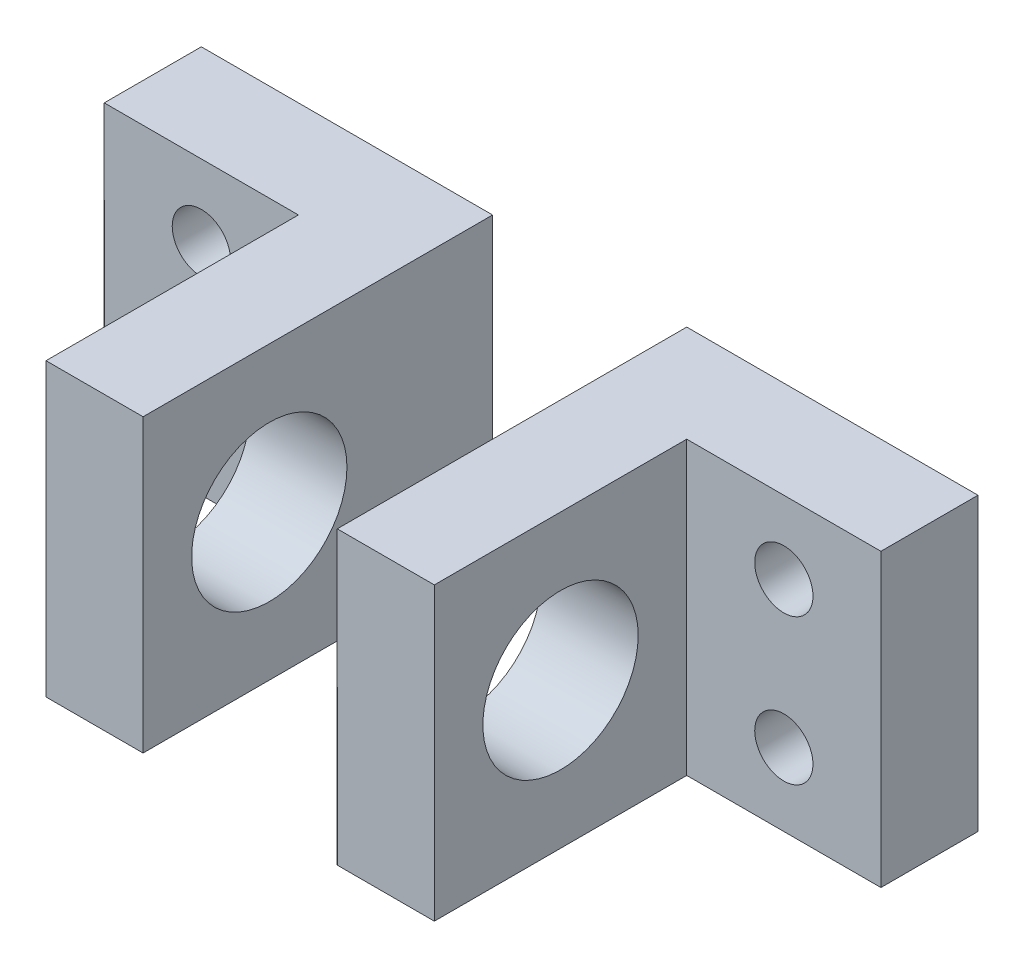
ISO-10303-21;
HEADER;
FILE_DESCRIPTION(('STEP AP214'),'2;1');
FILE_NAME('part.step','',(''),(''),'','','');
FILE_SCHEMA(('AUTOMOTIVE_DESIGN { 1 0 10303 214 1 1 1 1 }'));
ENDSEC;
DATA;
#1=APPLICATION_CONTEXT('core data for automotive mechanical design processes');
#2=APPLICATION_PROTOCOL_DEFINITION('international standard','automotive_design',2000,#1);
#3=PRODUCT_CONTEXT('',#1,'mechanical');
#4=PRODUCT('Part','Part','',(#3));
#5=PRODUCT_RELATED_PRODUCT_CATEGORY('part','',(#4));
#6=PRODUCT_DEFINITION_FORMATION('','',#4);
#7=PRODUCT_DEFINITION_CONTEXT('part definition',#1,'design');
#8=PRODUCT_DEFINITION('design','',#6,#7);
#9=PRODUCT_DEFINITION_SHAPE('','',#8);
#10=(LENGTH_UNIT() NAMED_UNIT(*) SI_UNIT(.MILLI.,.METRE.));
#11=(NAMED_UNIT(*) PLANE_ANGLE_UNIT() SI_UNIT($,.RADIAN.));
#12=(NAMED_UNIT(*) SI_UNIT($,.STERADIAN.) SOLID_ANGLE_UNIT());
#13=UNCERTAINTY_MEASURE_WITH_UNIT(LENGTH_MEASURE(1.E-05),#10,'distance_accuracy_value','');
#14=(GEOMETRIC_REPRESENTATION_CONTEXT(3) GLOBAL_UNCERTAINTY_ASSIGNED_CONTEXT((#13)) GLOBAL_UNIT_ASSIGNED_CONTEXT((#10,
#11,#12)) REPRESENTATION_CONTEXT('',''));
#15=CARTESIAN_POINT('',(0.,0.,0.));
#16=DIRECTION('',(0.,0.,1.));
#17=DIRECTION('',(1.,0.,0.));
#18=AXIS2_PLACEMENT_3D('',#15,#16,#17);
#19=CARTESIAN_POINT('',(20.,15.,-13.));
#20=DIRECTION('',(-1.,0.,0.));
#21=DIRECTION('',(0.,0.,1.));
#22=AXIS2_PLACEMENT_3D('',#19,#20,#21);
#23=PLANE('',#22);
#24=DIRECTION('',(0.,0.,-1.));
#25=VECTOR('',#24,1.);
#26=CARTESIAN_POINT('',(20.,0.,-13.));
#27=LINE('',#26,#25);
#28=CARTESIAN_POINT('',(20.,0.,-13.));
#29=VERTEX_POINT('',#28);
#30=CARTESIAN_POINT('',(20.,0.,-18.));
#31=VERTEX_POINT('',#30);
#32=EDGE_CURVE('E132',#29,#31,#27,.T.);
#33=ORIENTED_EDGE('',*,*,#32,.T.);
#34=DIRECTION('',(0.,-1.,0.));
#35=VECTOR('',#34,1.);
#36=CARTESIAN_POINT('',(20.,15.,-18.));
#37=LINE('',#36,#35);
#38=CARTESIAN_POINT('',(20.,15.,-18.));
#39=VERTEX_POINT('',#38);
#40=EDGE_CURVE('E12',#39,#31,#37,.T.);
#41=ORIENTED_EDGE('',*,*,#40,.F.);
#42=DIRECTION('',(0.,0.,-1.));
#43=VECTOR('',#42,1.);
#44=CARTESIAN_POINT('',(20.,15.,-13.));
#45=LINE('',#44,#43);
#46=CARTESIAN_POINT('',(20.,15.,-13.));
#47=VERTEX_POINT('',#46);
#48=EDGE_CURVE('E143',#47,#39,#45,.T.);
#49=ORIENTED_EDGE('',*,*,#48,.F.);
#50=DIRECTION('',(0.,-1.,0.));
#51=VECTOR('',#50,1.);
#52=CARTESIAN_POINT('',(20.,15.,-13.));
#53=LINE('',#52,#51);
#54=EDGE_CURVE('E128',#47,#29,#53,.T.);
#55=ORIENTED_EDGE('',*,*,#54,.T.);
#56=EDGE_LOOP('',(#33,#41,#49,#55));
#57=FACE_BOUND('',#56,.T.);
#58=ADVANCED_FACE('F48',(#57),#23,.F.);
#59=CARTESIAN_POINT('',(20.,15.,-18.));
#60=DIRECTION('',(0.,0.,1.));
#61=DIRECTION('',(1.,0.,0.));
#62=AXIS2_PLACEMENT_3D('',#59,#60,#61);
#63=PLANE('',#62);
#64=CARTESIAN_POINT('',(15.,11.25,-18.));
#65=DIRECTION('',(0.,0.,1.));
#66=DIRECTION('',(1.,0.,0.));
#67=AXIS2_PLACEMENT_3D('',#64,#65,#66);
#68=CIRCLE('',#67,1.5);
#69=CARTESIAN_POINT('',(16.5,11.25,-18.));
#70=VERTEX_POINT('',#69);
#71=EDGE_CURVE('E253',#70,#70,#68,.T.);
#72=ORIENTED_EDGE('',*,*,#71,.T.);
#73=EDGE_LOOP('',(#72));
#74=FACE_BOUND('',#73,.T.);
#75=CARTESIAN_POINT('',(15.,3.75,-18.));
#76=DIRECTION('',(0.,0.,1.));
#77=DIRECTION('',(-1.,0.,0.));
#78=AXIS2_PLACEMENT_3D('',#75,#76,#77);
#79=CIRCLE('',#78,1.5);
#80=CARTESIAN_POINT('',(13.5,3.75,-18.));
#81=VERTEX_POINT('',#80);
#82=EDGE_CURVE('E256',#81,#81,#79,.T.);
#83=ORIENTED_EDGE('',*,*,#82,.T.);
#84=EDGE_LOOP('',(#83));
#85=FACE_BOUND('',#84,.T.);
#86=DIRECTION('',(-1.,0.,0.));
#87=VECTOR('',#86,1.);
#88=CARTESIAN_POINT('',(20.,0.,-18.));
#89=LINE('',#88,#87);
#90=CARTESIAN_POINT('',(5.,0.,-18.));
#91=VERTEX_POINT('',#90);
#92=EDGE_CURVE('E135',#31,#91,#89,.T.);
#93=ORIENTED_EDGE('',*,*,#92,.T.);
#94=DIRECTION('',(0.,-1.,0.));
#95=VECTOR('',#94,1.);
#96=CARTESIAN_POINT('',(5.,15.,-18.));
#97=LINE('',#96,#95);
#98=CARTESIAN_POINT('',(5.,15.,-18.));
#99=VERTEX_POINT('',#98);
#100=EDGE_CURVE('E56',#99,#91,#97,.T.);
#101=ORIENTED_EDGE('',*,*,#100,.F.);
#102=DIRECTION('',(-1.,0.,0.));
#103=VECTOR('',#102,1.);
#104=CARTESIAN_POINT('',(20.,15.,-18.));
#105=LINE('',#104,#103);
#106=EDGE_CURVE('E101',#39,#99,#105,.T.);
#107=ORIENTED_EDGE('',*,*,#106,.F.);
#108=ORIENTED_EDGE('',*,*,#40,.T.);
#109=EDGE_LOOP('',(#93,#101,#107,#108));
#110=FACE_BOUND('',#109,.T.);
#111=ADVANCED_FACE('F171',(#74,#85,#110),#63,.F.);
#112=CARTESIAN_POINT('',(5.,15.,-18.));
#113=DIRECTION('',(1.,0.,0.));
#114=DIRECTION('',(0.,0.,-1.));
#115=AXIS2_PLACEMENT_3D('',#112,#113,#114);
#116=PLANE('',#115);
#117=CARTESIAN_POINT('',(5.,7.5,-6.5));
#118=DIRECTION('',(1.,0.,0.));
#119=DIRECTION('',(0.,0.,-1.));
#120=AXIS2_PLACEMENT_3D('',#117,#118,#119);
#121=CIRCLE('',#120,4.);
#122=CARTESIAN_POINT('',(5.,7.5,-10.5));
#123=VERTEX_POINT('',#122);
#124=EDGE_CURVE('E136',#123,#123,#121,.T.);
#125=ORIENTED_EDGE('',*,*,#124,.T.);
#126=EDGE_LOOP('',(#125));
#127=FACE_BOUND('',#126,.T.);
#128=DIRECTION('',(0.,0.,1.));
#129=VECTOR('',#128,1.);
#130=CARTESIAN_POINT('',(5.,0.,-18.));
#131=LINE('',#130,#129);
#132=CARTESIAN_POINT('',(5.,0.,0.));
#133=VERTEX_POINT('',#132);
#134=EDGE_CURVE('E138',#91,#133,#131,.T.);
#135=ORIENTED_EDGE('',*,*,#134,.T.);
#136=DIRECTION('',(0.,-1.,0.));
#137=VECTOR('',#136,1.);
#138=CARTESIAN_POINT('',(5.,15.,0.));
#139=LINE('',#138,#137);
#140=CARTESIAN_POINT('',(5.,15.,0.));
#141=VERTEX_POINT('',#140);
#142=EDGE_CURVE('E123',#141,#133,#139,.T.);
#143=ORIENTED_EDGE('',*,*,#142,.F.);
#144=DIRECTION('',(0.,0.,1.));
#145=VECTOR('',#144,1.);
#146=CARTESIAN_POINT('',(5.,15.,-18.));
#147=LINE('',#146,#145);
#148=EDGE_CURVE('E114',#99,#141,#147,.T.);
#149=ORIENTED_EDGE('',*,*,#148,.F.);
#150=ORIENTED_EDGE('',*,*,#100,.T.);
#151=EDGE_LOOP('',(#135,#143,#149,#150));
#152=FACE_BOUND('',#151,.T.);
#153=ADVANCED_FACE('F149',(#127,#152),#116,.F.);
#154=CARTESIAN_POINT('',(5.,15.,0.));
#155=DIRECTION('',(0.,0.,-1.));
#156=DIRECTION('',(-1.,0.,0.));
#157=AXIS2_PLACEMENT_3D('',#154,#155,#156);
#158=PLANE('',#157);
#159=DIRECTION('',(1.,0.,0.));
#160=VECTOR('',#159,1.);
#161=CARTESIAN_POINT('',(5.,0.,0.));
#162=LINE('',#161,#160);
#163=CARTESIAN_POINT('',(10.,0.,0.));
#164=VERTEX_POINT('',#163);
#165=EDGE_CURVE('E122',#133,#164,#162,.T.);
#166=ORIENTED_EDGE('',*,*,#165,.T.);
#167=DIRECTION('',(0.,-1.,0.));
#168=VECTOR('',#167,1.);
#169=CARTESIAN_POINT('',(10.,15.,0.));
#170=LINE('',#169,#168);
#171=CARTESIAN_POINT('',(10.,15.,0.));
#172=VERTEX_POINT('',#171);
#173=EDGE_CURVE('E119',#172,#164,#170,.T.);
#174=ORIENTED_EDGE('',*,*,#173,.F.);
#175=DIRECTION('',(1.,0.,0.));
#176=VECTOR('',#175,1.);
#177=CARTESIAN_POINT('',(5.,15.,0.));
#178=LINE('',#177,#176);
#179=EDGE_CURVE('E108',#141,#172,#178,.T.);
#180=ORIENTED_EDGE('',*,*,#179,.F.);
#181=ORIENTED_EDGE('',*,*,#142,.T.);
#182=EDGE_LOOP('',(#166,#174,#180,#181));
#183=FACE_BOUND('',#182,.T.);
#184=ADVANCED_FACE('F120',(#183),#158,.F.);
#185=CARTESIAN_POINT('',(10.,15.,0.));
#186=DIRECTION('',(-1.,0.,0.));
#187=DIRECTION('',(0.,0.,1.));
#188=AXIS2_PLACEMENT_3D('',#185,#186,#187);
#189=PLANE('',#188);
#190=CARTESIAN_POINT('',(10.,7.5,-6.5));
#191=DIRECTION('',(1.,0.,0.));
#192=DIRECTION('',(0.,0.,-1.));
#193=AXIS2_PLACEMENT_3D('',#190,#191,#192);
#194=CIRCLE('',#193,4.);
#195=CARTESIAN_POINT('',(10.,7.5,-10.5));
#196=VERTEX_POINT('',#195);
#197=EDGE_CURVE('E258',#196,#196,#194,.T.);
#198=ORIENTED_EDGE('',*,*,#197,.F.);
#199=EDGE_LOOP('',(#198));
#200=FACE_BOUND('',#199,.T.);
#201=DIRECTION('',(0.,0.,-1.));
#202=VECTOR('',#201,1.);
#203=CARTESIAN_POINT('',(10.,0.,0.));
#204=LINE('',#203,#202);
#205=CARTESIAN_POINT('',(10.,0.,-13.));
#206=VERTEX_POINT('',#205);
#207=EDGE_CURVE('E87',#164,#206,#204,.T.);
#208=ORIENTED_EDGE('',*,*,#207,.T.);
#209=DIRECTION('',(0.,-1.,0.));
#210=VECTOR('',#209,1.);
#211=CARTESIAN_POINT('',(10.,15.,-13.));
#212=LINE('',#211,#210);
#213=CARTESIAN_POINT('',(10.,15.,-13.));
#214=VERTEX_POINT('',#213);
#215=EDGE_CURVE('E124',#214,#206,#212,.T.);
#216=ORIENTED_EDGE('',*,*,#215,.F.);
#217=DIRECTION('',(0.,0.,-1.));
#218=VECTOR('',#217,1.);
#219=CARTESIAN_POINT('',(10.,15.,0.));
#220=LINE('',#219,#218);
#221=EDGE_CURVE('E112',#172,#214,#220,.T.);
#222=ORIENTED_EDGE('',*,*,#221,.F.);
#223=ORIENTED_EDGE('',*,*,#173,.T.);
#224=EDGE_LOOP('',(#208,#216,#222,#223));
#225=FACE_BOUND('',#224,.T.);
#226=ADVANCED_FACE('F126',(#200,#225),#189,.F.);
#227=CARTESIAN_POINT('',(10.,15.,-13.));
#228=DIRECTION('',(0.,0.,-1.));
#229=DIRECTION('',(-1.,0.,0.));
#230=AXIS2_PLACEMENT_3D('',#227,#228,#229);
#231=PLANE('',#230);
#232=CARTESIAN_POINT('',(15.,11.25,-13.));
#233=DIRECTION('',(0.,0.,1.));
#234=DIRECTION('',(1.,0.,0.));
#235=AXIS2_PLACEMENT_3D('',#232,#233,#234);
#236=CIRCLE('',#235,1.5);
#237=CARTESIAN_POINT('',(16.5,11.25,-13.));
#238=VERTEX_POINT('',#237);
#239=EDGE_CURVE('E255',#238,#238,#236,.T.);
#240=ORIENTED_EDGE('',*,*,#239,.F.);
#241=EDGE_LOOP('',(#240));
#242=FACE_BOUND('',#241,.T.);
#243=CARTESIAN_POINT('',(15.,3.75,-13.));
#244=DIRECTION('',(0.,0.,1.));
#245=DIRECTION('',(-1.,0.,0.));
#246=AXIS2_PLACEMENT_3D('',#243,#244,#245);
#247=CIRCLE('',#246,1.5);
#248=CARTESIAN_POINT('',(13.5,3.75,-13.));
#249=VERTEX_POINT('',#248);
#250=EDGE_CURVE('E261',#249,#249,#247,.T.);
#251=ORIENTED_EDGE('',*,*,#250,.F.);
#252=EDGE_LOOP('',(#251));
#253=FACE_BOUND('',#252,.T.);
#254=DIRECTION('',(1.,0.,0.));
#255=VECTOR('',#254,1.);
#256=CARTESIAN_POINT('',(10.,0.,-13.));
#257=LINE('',#256,#255);
#258=EDGE_CURVE('E93',#206,#29,#257,.T.);
#259=ORIENTED_EDGE('',*,*,#258,.T.);
#260=ORIENTED_EDGE('',*,*,#54,.F.);
#261=DIRECTION('',(1.,0.,0.));
#262=VECTOR('',#261,1.);
#263=CARTESIAN_POINT('',(10.,15.,-13.));
#264=LINE('',#263,#262);
#265=EDGE_CURVE('E64',#214,#47,#264,.T.);
#266=ORIENTED_EDGE('',*,*,#265,.F.);
#267=ORIENTED_EDGE('',*,*,#215,.T.);
#268=EDGE_LOOP('',(#259,#260,#266,#267));
#269=FACE_BOUND('',#268,.T.);
#270=ADVANCED_FACE('F156',(#242,#253,#269),#231,.F.);
#271=CARTESIAN_POINT('',(0.,15.,0.));
#272=DIRECTION('',(0.,1.,0.));
#273=DIRECTION('',(0.,0.,1.));
#274=AXIS2_PLACEMENT_3D('',#271,#272,#273);
#275=PLANE('',#274);
#276=ORIENTED_EDGE('',*,*,#48,.T.);
#277=ORIENTED_EDGE('',*,*,#106,.T.);
#278=ORIENTED_EDGE('',*,*,#148,.T.);
#279=ORIENTED_EDGE('',*,*,#179,.T.);
#280=ORIENTED_EDGE('',*,*,#221,.T.);
#281=ORIENTED_EDGE('',*,*,#265,.T.);
#282=EDGE_LOOP('',(#276,#277,#278,#279,#280,#281));
#283=FACE_BOUND('',#282,.T.);
#284=ADVANCED_FACE('F110',(#283),#275,.T.);
#285=CARTESIAN_POINT('',(0.,0.,0.));
#286=DIRECTION('',(0.,1.,0.));
#287=DIRECTION('',(0.,0.,1.));
#288=AXIS2_PLACEMENT_3D('',#285,#286,#287);
#289=PLANE('',#288);
#290=ORIENTED_EDGE('',*,*,#32,.F.);
#291=ORIENTED_EDGE('',*,*,#258,.F.);
#292=ORIENTED_EDGE('',*,*,#207,.F.);
#293=ORIENTED_EDGE('',*,*,#165,.F.);
#294=ORIENTED_EDGE('',*,*,#134,.F.);
#295=ORIENTED_EDGE('',*,*,#92,.F.);
#296=EDGE_LOOP('',(#290,#291,#292,#293,#294,#295));
#297=FACE_BOUND('',#296,.T.);
#298=ADVANCED_FACE('F152',(#297),#289,.F.);
#299=CARTESIAN_POINT('',(-20.,7.5,-6.5));
#300=DIRECTION('',(1.,0.,0.));
#301=DIRECTION('',(0.,0.,-1.));
#302=AXIS2_PLACEMENT_3D('',#299,#300,#301);
#303=CYLINDRICAL_SURFACE('',#302,4.);
#304=CARTESIAN_POINT('',(10.,7.5,-10.5));
#305=CARTESIAN_POINT('',(9.94791666666667,7.5,-10.5));
#306=CARTESIAN_POINT('',(9.89583333333333,7.5,-10.5));
#307=CARTESIAN_POINT('',(9.79166666666667,7.5,-10.5));
#308=CARTESIAN_POINT('',(9.73958333333333,7.5,-10.5));
#309=CARTESIAN_POINT('',(9.63541666666667,7.5,-10.5));
#310=CARTESIAN_POINT('',(9.58333333333333,7.5,-10.5));
#311=CARTESIAN_POINT('',(9.47916666666667,7.5,-10.5));
#312=CARTESIAN_POINT('',(9.42708333333333,7.5,-10.5));
#313=CARTESIAN_POINT('',(9.32291666666666,7.5,-10.5));
#314=CARTESIAN_POINT('',(9.27083333333333,7.5,-10.5));
#315=CARTESIAN_POINT('',(9.16666666666666,7.5,-10.5));
#316=CARTESIAN_POINT('',(9.11458333333333,7.5,-10.5));
#317=CARTESIAN_POINT('',(9.01041666666666,7.5,-10.5));
#318=CARTESIAN_POINT('',(8.95833333333333,7.5,-10.5));
#319=CARTESIAN_POINT('',(8.85416666666666,7.5,-10.5));
#320=CARTESIAN_POINT('',(8.80208333333333,7.5,-10.5));
#321=CARTESIAN_POINT('',(8.69791666666666,7.5,-10.5));
#322=CARTESIAN_POINT('',(8.64583333333333,7.5,-10.5));
#323=CARTESIAN_POINT('',(8.54166666666667,7.5,-10.5));
#324=CARTESIAN_POINT('',(8.48958333333333,7.5,-10.5));
#325=CARTESIAN_POINT('',(8.38541666666667,7.5,-10.5));
#326=CARTESIAN_POINT('',(8.33333333333333,7.5,-10.5));
#327=CARTESIAN_POINT('',(8.22916666666667,7.5,-10.5));
#328=CARTESIAN_POINT('',(8.17708333333333,7.5,-10.5));
#329=CARTESIAN_POINT('',(8.07291666666667,7.5,-10.5));
#330=CARTESIAN_POINT('',(8.02083333333333,7.5,-10.5));
#331=CARTESIAN_POINT('',(7.91666666666667,7.5,-10.5));
#332=CARTESIAN_POINT('',(7.86458333333333,7.5,-10.5));
#333=CARTESIAN_POINT('',(7.76041666666667,7.5,-10.5));
#334=CARTESIAN_POINT('',(7.70833333333333,7.5,-10.5));
#335=CARTESIAN_POINT('',(7.60416666666667,7.5,-10.5));
#336=CARTESIAN_POINT('',(7.55208333333333,7.5,-10.5));
#337=CARTESIAN_POINT('',(7.44791666666667,7.5,-10.5));
#338=CARTESIAN_POINT('',(7.39583333333333,7.5,-10.5));
#339=CARTESIAN_POINT('',(7.29166666666667,7.5,-10.5));
#340=CARTESIAN_POINT('',(7.23958333333333,7.5,-10.5));
#341=CARTESIAN_POINT('',(7.13541666666667,7.5,-10.5));
#342=CARTESIAN_POINT('',(7.08333333333333,7.5,-10.5));
#343=CARTESIAN_POINT('',(6.97916666666667,7.5,-10.5));
#344=CARTESIAN_POINT('',(6.92708333333333,7.5,-10.5));
#345=CARTESIAN_POINT('',(6.82291666666667,7.5,-10.5));
#346=CARTESIAN_POINT('',(6.77083333333333,7.5,-10.5));
#347=CARTESIAN_POINT('',(6.66666666666667,7.5,-10.5));
#348=CARTESIAN_POINT('',(6.61458333333333,7.5,-10.5));
#349=CARTESIAN_POINT('',(6.51041666666667,7.5,-10.5));
#350=CARTESIAN_POINT('',(6.45833333333333,7.5,-10.5));
#351=CARTESIAN_POINT('',(6.35416666666667,7.5,-10.5));
#352=CARTESIAN_POINT('',(6.30208333333333,7.5,-10.5));
#353=CARTESIAN_POINT('',(6.19791666666667,7.5,-10.5));
#354=CARTESIAN_POINT('',(6.14583333333333,7.5,-10.5));
#355=CARTESIAN_POINT('',(6.04166666666667,7.5,-10.5));
#356=CARTESIAN_POINT('',(5.98958333333333,7.5,-10.5));
#357=CARTESIAN_POINT('',(5.88541666666667,7.5,-10.5));
#358=CARTESIAN_POINT('',(5.83333333333334,7.5,-10.5));
#359=CARTESIAN_POINT('',(5.72916666666667,7.5,-10.5));
#360=CARTESIAN_POINT('',(5.67708333333333,7.5,-10.5));
#361=CARTESIAN_POINT('',(5.57291666666667,7.5,-10.5));
#362=CARTESIAN_POINT('',(5.52083333333333,7.5,-10.5));
#363=CARTESIAN_POINT('',(5.41666666666667,7.5,-10.5));
#364=CARTESIAN_POINT('',(5.36458333333333,7.5,-10.5));
#365=CARTESIAN_POINT('',(5.26041666666667,7.5,-10.5));
#366=CARTESIAN_POINT('',(5.20833333333333,7.5,-10.5));
#367=CARTESIAN_POINT('',(5.10416666666667,7.5,-10.5));
#368=CARTESIAN_POINT('',(5.05208333333333,7.5,-10.5));
#369=CARTESIAN_POINT('',(5.,7.5,-10.5));
#370=B_SPLINE_CURVE_WITH_KNOTS('',3,(#304,#305,#306,#307,#308,#309,#310,#311,#312,#313,#314,
#315,#316,#317,#318,#319,#320,#321,#322,#323,#324,#325,#326,#327,#328,#329,#330,#331,#332,#333,
#334,#335,#336,#337,#338,#339,#340,#341,#342,#343,#344,#345,#346,#347,#348,#349,#350,#351,#352,
#353,#354,#355,#356,#357,#358,#359,#360,#361,#362,#363,#364,#365,#366,#367,#368,#369),
.UNSPECIFIED.,.F.,.F.,(4,2,2,2,2,2,2,2,2,2,2,2,2,2,2,2,2,2,2,2,2,2,2,2,2,2,2,2,2,2,2,2,4),(0.,
0.15625,0.3125,0.46875,0.625000000000001,0.781250000000001,0.937500000000001,1.09375,1.25,
1.40625,1.5625,1.71875,1.875,2.03125,2.1875,2.34375,2.5,2.65625,2.8125,2.96875,3.125,3.28125,
3.4375,3.59375,3.75,3.90625,4.0625,4.21875,4.375,4.53125,4.6875,4.84375,5.),.UNSPECIFIED.);
#371=EDGE_CURVE('BSEAM203',#196,#123,#370,.T.);
#372=ORIENTED_EDGE('',*,*,#197,.T.);
#373=ORIENTED_EDGE('',*,*,#124,.F.);
#374=ORIENTED_EDGE('',*,*,#371,.T.);
#375=ORIENTED_EDGE('',*,*,#371,.F.);
#376=EDGE_LOOP('',(#372,#374,#373,#375));
#377=FACE_BOUND('',#376,.T.);
#378=ADVANCED_FACE('F203',(#377),#303,.F.);
#379=CARTESIAN_POINT('',(15.,3.75,-18.));
#380=DIRECTION('',(0.,0.,1.));
#381=DIRECTION('',(1.,0.,0.));
#382=AXIS2_PLACEMENT_3D('',#379,#380,#381);
#383=CYLINDRICAL_SURFACE('',#382,1.5);
#384=ORIENTED_EDGE('',*,*,#82,.F.);
#385=EDGE_LOOP('',(#384));
#386=FACE_BOUND('',#385,.T.);
#387=ORIENTED_EDGE('',*,*,#250,.T.);
#388=EDGE_LOOP('',(#387));
#389=FACE_BOUND('',#388,.T.);
#390=ADVANCED_FACE('F207',(#386,#389),#383,.F.);
#391=CARTESIAN_POINT('',(15.,11.25,-18.));
#392=DIRECTION('',(0.,0.,1.));
#393=DIRECTION('',(1.,0.,0.));
#394=AXIS2_PLACEMENT_3D('',#391,#392,#393);
#395=CYLINDRICAL_SURFACE('',#394,1.5);
#396=ORIENTED_EDGE('',*,*,#71,.F.);
#397=EDGE_LOOP('',(#396));
#398=FACE_BOUND('',#397,.T.);
#399=ORIENTED_EDGE('',*,*,#239,.T.);
#400=EDGE_LOOP('',(#399));
#401=FACE_BOUND('',#400,.T.);
#402=ADVANCED_FACE('F229',(#398,#401),#395,.F.);
#403=CLOSED_SHELL('',(#58,#111,#153,#184,#226,#270,#284,#298,#378,#390,#402));
#404=MANIFOLD_SOLID_BREP('B2',#403);
#405=CARTESIAN_POINT('',(-20.,15.,-18.));
#406=DIRECTION('',(0.,0.,1.));
#407=DIRECTION('',(1.,0.,0.));
#408=AXIS2_PLACEMENT_3D('',#405,#406,#407);
#409=PLANE('',#408);
#410=CARTESIAN_POINT('',(-15.,3.75,-18.));
#411=DIRECTION('',(0.,0.,1.));
#412=DIRECTION('',(1.,0.,0.));
#413=AXIS2_PLACEMENT_3D('',#410,#411,#412);
#414=CIRCLE('',#413,1.5);
#415=CARTESIAN_POINT('',(-13.5,3.75,-18.));
#416=VERTEX_POINT('',#415);
#417=EDGE_CURVE('E432',#416,#416,#414,.T.);
#418=ORIENTED_EDGE('',*,*,#417,.T.);
#419=EDGE_LOOP('',(#418));
#420=FACE_BOUND('',#419,.T.);
#421=CARTESIAN_POINT('',(-15.,11.25,-18.));
#422=DIRECTION('',(0.,0.,1.));
#423=DIRECTION('',(-1.,0.,0.));
#424=AXIS2_PLACEMENT_3D('',#421,#422,#423);
#425=CIRCLE('',#424,1.5);
#426=CARTESIAN_POINT('',(-16.5,11.25,-18.));
#427=VERTEX_POINT('',#426);
#428=EDGE_CURVE('E435',#427,#427,#425,.T.);
#429=ORIENTED_EDGE('',*,*,#428,.T.);
#430=EDGE_LOOP('',(#429));
#431=FACE_BOUND('',#430,.T.);
#432=DIRECTION('',(-1.,0.,0.));
#433=VECTOR('',#432,1.);
#434=CARTESIAN_POINT('',(-20.,0.,-18.));
#435=LINE('',#434,#433);
#436=CARTESIAN_POINT('',(-5.,0.,-18.));
#437=VERTEX_POINT('',#436);
#438=CARTESIAN_POINT('',(-20.,0.,-18.));
#439=VERTEX_POINT('',#438);
#440=EDGE_CURVE('E376',#437,#439,#435,.T.);
#441=ORIENTED_EDGE('',*,*,#440,.T.);
#442=DIRECTION('',(0.,-1.,0.));
#443=VECTOR('',#442,1.);
#444=CARTESIAN_POINT('',(-20.,15.,-18.));
#445=LINE('',#444,#443);
#446=CARTESIAN_POINT('',(-20.,15.,-18.));
#447=VERTEX_POINT('',#446);
#448=EDGE_CURVE('E46',#447,#439,#445,.T.);
#449=ORIENTED_EDGE('',*,*,#448,.F.);
#450=DIRECTION('',(-1.,0.,0.));
#451=VECTOR('',#450,1.);
#452=CARTESIAN_POINT('',(-20.,15.,-18.));
#453=LINE('',#452,#451);
#454=CARTESIAN_POINT('',(-5.,15.,-18.));
#455=VERTEX_POINT('',#454);
#456=EDGE_CURVE('E393',#455,#447,#453,.T.);
#457=ORIENTED_EDGE('',*,*,#456,.F.);
#458=DIRECTION('',(0.,-1.,0.));
#459=VECTOR('',#458,1.);
#460=CARTESIAN_POINT('',(-5.,15.,-18.));
#461=LINE('',#460,#459);
#462=EDGE_CURVE('E372',#455,#437,#461,.T.);
#463=ORIENTED_EDGE('',*,*,#462,.T.);
#464=EDGE_LOOP('',(#441,#449,#457,#463));
#465=FACE_BOUND('',#464,.T.);
#466=ADVANCED_FACE('F286',(#420,#431,#465),#409,.F.);
#467=CARTESIAN_POINT('',(-20.,15.,-13.));
#468=DIRECTION('',(1.,0.,0.));
#469=DIRECTION('',(0.,0.,-1.));
#470=AXIS2_PLACEMENT_3D('',#467,#468,#469);
#471=PLANE('',#470);
#472=DIRECTION('',(0.,0.,1.));
#473=VECTOR('',#472,1.);
#474=CARTESIAN_POINT('',(-20.,0.,-13.));
#475=LINE('',#474,#473);
#476=CARTESIAN_POINT('',(-20.,0.,-13.));
#477=VERTEX_POINT('',#476);
#478=EDGE_CURVE('E380',#439,#477,#475,.T.);
#479=ORIENTED_EDGE('',*,*,#478,.T.);
#480=DIRECTION('',(0.,-1.,0.));
#481=VECTOR('',#480,1.);
#482=CARTESIAN_POINT('',(-20.,15.,-13.));
#483=LINE('',#482,#481);
#484=CARTESIAN_POINT('',(-20.,15.,-13.));
#485=VERTEX_POINT('',#484);
#486=EDGE_CURVE('E296',#485,#477,#483,.T.);
#487=ORIENTED_EDGE('',*,*,#486,.F.);
#488=DIRECTION('',(0.,0.,1.));
#489=VECTOR('',#488,1.);
#490=CARTESIAN_POINT('',(-20.,15.,-13.));
#491=LINE('',#490,#489);
#492=EDGE_CURVE('E341',#447,#485,#491,.T.);
#493=ORIENTED_EDGE('',*,*,#492,.F.);
#494=ORIENTED_EDGE('',*,*,#448,.T.);
#495=EDGE_LOOP('',(#479,#487,#493,#494));
#496=FACE_BOUND('',#495,.T.);
#497=ADVANCED_FACE('F424',(#496),#471,.F.);
#498=CARTESIAN_POINT('',(-10.,15.,-13.));
#499=DIRECTION('',(0.,0.,-1.));
#500=DIRECTION('',(-1.,0.,0.));
#501=AXIS2_PLACEMENT_3D('',#498,#499,#500);
#502=PLANE('',#501);
#503=CARTESIAN_POINT('',(-15.,3.75,-13.));
#504=DIRECTION('',(0.,0.,1.));
#505=DIRECTION('',(1.,0.,0.));
#506=AXIS2_PLACEMENT_3D('',#503,#504,#505);
#507=CIRCLE('',#506,1.5);
#508=CARTESIAN_POINT('',(-13.5,3.75,-13.));
#509=VERTEX_POINT('',#508);
#510=EDGE_CURVE('E438',#509,#509,#507,.T.);
#511=ORIENTED_EDGE('',*,*,#510,.F.);
#512=EDGE_LOOP('',(#511));
#513=FACE_BOUND('',#512,.T.);
#514=CARTESIAN_POINT('',(-15.,11.25,-13.));
#515=DIRECTION('',(0.,0.,1.));
#516=DIRECTION('',(-1.,0.,0.));
#517=AXIS2_PLACEMENT_3D('',#514,#515,#516);
#518=CIRCLE('',#517,1.5);
#519=CARTESIAN_POINT('',(-16.5,11.25,-13.));
#520=VERTEX_POINT('',#519);
#521=EDGE_CURVE('E439',#520,#520,#518,.T.);
#522=ORIENTED_EDGE('',*,*,#521,.F.);
#523=EDGE_LOOP('',(#522));
#524=FACE_BOUND('',#523,.T.);
#525=DIRECTION('',(1.,0.,0.));
#526=VECTOR('',#525,1.);
#527=CARTESIAN_POINT('',(-10.,0.,-13.));
#528=LINE('',#527,#526);
#529=CARTESIAN_POINT('',(-10.,0.,-13.));
#530=VERTEX_POINT('',#529);
#531=EDGE_CURVE('E384',#477,#530,#528,.T.);
#532=ORIENTED_EDGE('',*,*,#531,.T.);
#533=DIRECTION('',(0.,-1.,0.));
#534=VECTOR('',#533,1.);
#535=CARTESIAN_POINT('',(-10.,15.,-13.));
#536=LINE('',#535,#534);
#537=CARTESIAN_POINT('',(-10.,15.,-13.));
#538=VERTEX_POINT('',#537);
#539=EDGE_CURVE('E365',#538,#530,#536,.T.);
#540=ORIENTED_EDGE('',*,*,#539,.F.);
#541=DIRECTION('',(1.,0.,0.));
#542=VECTOR('',#541,1.);
#543=CARTESIAN_POINT('',(-10.,15.,-13.));
#544=LINE('',#543,#542);
#545=EDGE_CURVE('E354',#485,#538,#544,.T.);
#546=ORIENTED_EDGE('',*,*,#545,.F.);
#547=ORIENTED_EDGE('',*,*,#486,.T.);
#548=EDGE_LOOP('',(#532,#540,#546,#547));
#549=FACE_BOUND('',#548,.T.);
#550=ADVANCED_FACE('F404',(#513,#524,#549),#502,.F.);
#551=CARTESIAN_POINT('',(-10.,15.,0.));
#552=DIRECTION('',(1.,0.,0.));
#553=DIRECTION('',(0.,0.,-1.));
#554=AXIS2_PLACEMENT_3D('',#551,#552,#553);
#555=PLANE('',#554);
#556=CARTESIAN_POINT('',(-10.,7.5,-6.5));
#557=DIRECTION('',(1.,0.,0.));
#558=DIRECTION('',(0.,0.,-1.));
#559=AXIS2_PLACEMENT_3D('',#556,#557,#558);
#560=CIRCLE('',#559,4.);
#561=CARTESIAN_POINT('',(-10.,7.5,-10.5));
#562=VERTEX_POINT('',#561);
#563=EDGE_CURVE('E381',#562,#562,#560,.T.);
#564=ORIENTED_EDGE('',*,*,#563,.T.);
#565=EDGE_LOOP('',(#564));
#566=FACE_BOUND('',#565,.T.);
#567=DIRECTION('',(0.,0.,1.));
#568=VECTOR('',#567,1.);
#569=CARTESIAN_POINT('',(-10.,0.,0.));
#570=LINE('',#569,#568);
#571=CARTESIAN_POINT('',(-10.,0.,0.));
#572=VERTEX_POINT('',#571);
#573=EDGE_CURVE('E363',#530,#572,#570,.T.);
#574=ORIENTED_EDGE('',*,*,#573,.T.);
#575=DIRECTION('',(0.,-1.,0.));
#576=VECTOR('',#575,1.);
#577=CARTESIAN_POINT('',(-10.,15.,0.));
#578=LINE('',#577,#576);
#579=CARTESIAN_POINT('',(-10.,15.,0.));
#580=VERTEX_POINT('',#579);
#581=EDGE_CURVE('E360',#580,#572,#578,.T.);
#582=ORIENTED_EDGE('',*,*,#581,.F.);
#583=DIRECTION('',(0.,0.,1.));
#584=VECTOR('',#583,1.);
#585=CARTESIAN_POINT('',(-10.,15.,0.));
#586=LINE('',#585,#584);
#587=EDGE_CURVE('E348',#538,#580,#586,.T.);
#588=ORIENTED_EDGE('',*,*,#587,.F.);
#589=ORIENTED_EDGE('',*,*,#539,.T.);
#590=EDGE_LOOP('',(#574,#582,#588,#589));
#591=FACE_BOUND('',#590,.T.);
#592=ADVANCED_FACE('F361',(#566,#591),#555,.F.);
#593=CARTESIAN_POINT('',(-5.,15.,0.));
#594=DIRECTION('',(0.,0.,-1.));
#595=DIRECTION('',(-1.,0.,0.));
#596=AXIS2_PLACEMENT_3D('',#593,#594,#595);
#597=PLANE('',#596);
#598=DIRECTION('',(1.,0.,0.));
#599=VECTOR('',#598,1.);
#600=CARTESIAN_POINT('',(-5.,0.,0.));
#601=LINE('',#600,#599);
#602=CARTESIAN_POINT('',(-5.,0.,0.));
#603=VERTEX_POINT('',#602);
#604=EDGE_CURVE('E327',#572,#603,#601,.T.);
#605=ORIENTED_EDGE('',*,*,#604,.T.);
#606=DIRECTION('',(0.,-1.,0.));
#607=VECTOR('',#606,1.);
#608=CARTESIAN_POINT('',(-5.,15.,0.));
#609=LINE('',#608,#607);
#610=CARTESIAN_POINT('',(-5.,15.,0.));
#611=VERTEX_POINT('',#610);
#612=EDGE_CURVE('E366',#611,#603,#609,.T.);
#613=ORIENTED_EDGE('',*,*,#612,.F.);
#614=DIRECTION('',(1.,0.,0.));
#615=VECTOR('',#614,1.);
#616=CARTESIAN_POINT('',(-5.,15.,0.));
#617=LINE('',#616,#615);
#618=EDGE_CURVE('E352',#580,#611,#617,.T.);
#619=ORIENTED_EDGE('',*,*,#618,.F.);
#620=ORIENTED_EDGE('',*,*,#581,.T.);
#621=EDGE_LOOP('',(#605,#613,#619,#620));
#622=FACE_BOUND('',#621,.T.);
#623=ADVANCED_FACE('F368',(#622),#597,.F.);
#624=CARTESIAN_POINT('',(-5.,15.,-18.));
#625=DIRECTION('',(-1.,0.,0.));
#626=DIRECTION('',(0.,0.,1.));
#627=AXIS2_PLACEMENT_3D('',#624,#625,#626);
#628=PLANE('',#627);
#629=CARTESIAN_POINT('',(-5.,7.5,-6.5));
#630=DIRECTION('',(-1.,0.,0.));
#631=DIRECTION('',(0.,0.,1.));
#632=AXIS2_PLACEMENT_3D('',#629,#630,#631);
#633=CIRCLE('',#632,4.);
#634=CARTESIAN_POINT('',(-5.,7.5,-10.5));
#635=VERTEX_POINT('',#634);
#636=EDGE_CURVE('E289',#635,#635,#633,.T.);
#637=ORIENTED_EDGE('',*,*,#636,.T.);
#638=EDGE_LOOP('',(#637));
#639=FACE_BOUND('',#638,.T.);
#640=DIRECTION('',(0.,0.,-1.));
#641=VECTOR('',#640,1.);
#642=CARTESIAN_POINT('',(-5.,0.,-18.));
#643=LINE('',#642,#641);
#644=EDGE_CURVE('E333',#603,#437,#643,.T.);
#645=ORIENTED_EDGE('',*,*,#644,.T.);
#646=ORIENTED_EDGE('',*,*,#462,.F.);
#647=DIRECTION('',(0.,0.,-1.));
#648=VECTOR('',#647,1.);
#649=CARTESIAN_POINT('',(-5.,15.,-18.));
#650=LINE('',#649,#648);
#651=EDGE_CURVE('E304',#611,#455,#650,.T.);
#652=ORIENTED_EDGE('',*,*,#651,.F.);
#653=ORIENTED_EDGE('',*,*,#612,.T.);
#654=EDGE_LOOP('',(#645,#646,#652,#653));
#655=FACE_BOUND('',#654,.T.);
#656=ADVANCED_FACE('F411',(#639,#655),#628,.F.);
#657=CARTESIAN_POINT('',(0.,15.,0.));
#658=DIRECTION('',(0.,-1.,0.));
#659=DIRECTION('',(0.,0.,-1.));
#660=AXIS2_PLACEMENT_3D('',#657,#658,#659);
#661=PLANE('',#660);
#662=ORIENTED_EDGE('',*,*,#456,.T.);
#663=ORIENTED_EDGE('',*,*,#492,.T.);
#664=ORIENTED_EDGE('',*,*,#545,.T.);
#665=ORIENTED_EDGE('',*,*,#587,.T.);
#666=ORIENTED_EDGE('',*,*,#618,.T.);
#667=ORIENTED_EDGE('',*,*,#651,.T.);
#668=EDGE_LOOP('',(#662,#663,#664,#665,#666,#667));
#669=FACE_BOUND('',#668,.T.);
#670=ADVANCED_FACE('F350',(#669),#661,.F.);
#671=CARTESIAN_POINT('',(0.,0.,0.));
#672=DIRECTION('',(0.,-1.,0.));
#673=DIRECTION('',(0.,0.,-1.));
#674=AXIS2_PLACEMENT_3D('',#671,#672,#673);
#675=PLANE('',#674);
#676=ORIENTED_EDGE('',*,*,#440,.F.);
#677=ORIENTED_EDGE('',*,*,#644,.F.);
#678=ORIENTED_EDGE('',*,*,#604,.F.);
#679=ORIENTED_EDGE('',*,*,#573,.F.);
#680=ORIENTED_EDGE('',*,*,#531,.F.);
#681=ORIENTED_EDGE('',*,*,#478,.F.);
#682=EDGE_LOOP('',(#676,#677,#678,#679,#680,#681));
#683=FACE_BOUND('',#682,.T.);
#684=ADVANCED_FACE('F407',(#683),#675,.T.);
#685=CARTESIAN_POINT('',(-20.,7.5,-6.5));
#686=DIRECTION('',(1.,0.,0.));
#687=DIRECTION('',(0.,0.,-1.));
#688=AXIS2_PLACEMENT_3D('',#685,#686,#687);
#689=CYLINDRICAL_SURFACE('',#688,4.);
#690=CARTESIAN_POINT('',(-5.,7.5,-10.5));
#691=CARTESIAN_POINT('',(-5.05208333333333,7.5,-10.5));
#692=CARTESIAN_POINT('',(-5.10416666666667,7.5,-10.5));
#693=CARTESIAN_POINT('',(-5.20833333333333,7.5,-10.5));
#694=CARTESIAN_POINT('',(-5.26041666666667,7.5,-10.5));
#695=CARTESIAN_POINT('',(-5.36458333333333,7.5,-10.5));
#696=CARTESIAN_POINT('',(-5.41666666666667,7.5,-10.5));
#697=CARTESIAN_POINT('',(-5.52083333333333,7.5,-10.5));
#698=CARTESIAN_POINT('',(-5.57291666666667,7.5,-10.5));
#699=CARTESIAN_POINT('',(-5.67708333333333,7.5,-10.5));
#700=CARTESIAN_POINT('',(-5.72916666666667,7.5,-10.5));
#701=CARTESIAN_POINT('',(-5.83333333333333,7.5,-10.5));
#702=CARTESIAN_POINT('',(-5.88541666666667,7.5,-10.5));
#703=CARTESIAN_POINT('',(-5.98958333333333,7.5,-10.5));
#704=CARTESIAN_POINT('',(-6.04166666666667,7.5,-10.5));
#705=CARTESIAN_POINT('',(-6.14583333333333,7.5,-10.5));
#706=CARTESIAN_POINT('',(-6.19791666666667,7.5,-10.5));
#707=CARTESIAN_POINT('',(-6.30208333333333,7.5,-10.5));
#708=CARTESIAN_POINT('',(-6.35416666666667,7.5,-10.5));
#709=CARTESIAN_POINT('',(-6.45833333333333,7.5,-10.5));
#710=CARTESIAN_POINT('',(-6.51041666666667,7.5,-10.5));
#711=CARTESIAN_POINT('',(-6.61458333333333,7.5,-10.5));
#712=CARTESIAN_POINT('',(-6.66666666666667,7.5,-10.5));
#713=CARTESIAN_POINT('',(-6.77083333333333,7.5,-10.5));
#714=CARTESIAN_POINT('',(-6.82291666666667,7.5,-10.5));
#715=CARTESIAN_POINT('',(-6.92708333333333,7.5,-10.5));
#716=CARTESIAN_POINT('',(-6.97916666666667,7.5,-10.5));
#717=CARTESIAN_POINT('',(-7.08333333333333,7.5,-10.5));
#718=CARTESIAN_POINT('',(-7.13541666666667,7.5,-10.5));
#719=CARTESIAN_POINT('',(-7.23958333333333,7.5,-10.5));
#720=CARTESIAN_POINT('',(-7.29166666666667,7.5,-10.5));
#721=CARTESIAN_POINT('',(-7.39583333333333,7.5,-10.5));
#722=CARTESIAN_POINT('',(-7.44791666666667,7.5,-10.5));
#723=CARTESIAN_POINT('',(-7.55208333333333,7.5,-10.5));
#724=CARTESIAN_POINT('',(-7.60416666666667,7.5,-10.5));
#725=CARTESIAN_POINT('',(-7.70833333333333,7.5,-10.5));
#726=CARTESIAN_POINT('',(-7.76041666666667,7.5,-10.5));
#727=CARTESIAN_POINT('',(-7.86458333333333,7.5,-10.5));
#728=CARTESIAN_POINT('',(-7.91666666666667,7.5,-10.5));
#729=CARTESIAN_POINT('',(-8.02083333333333,7.5,-10.5));
#730=CARTESIAN_POINT('',(-8.07291666666667,7.5,-10.5));
#731=CARTESIAN_POINT('',(-8.17708333333333,7.5,-10.5));
#732=CARTESIAN_POINT('',(-8.22916666666667,7.5,-10.5));
#733=CARTESIAN_POINT('',(-8.33333333333333,7.5,-10.5));
#734=CARTESIAN_POINT('',(-8.38541666666667,7.5,-10.5));
#735=CARTESIAN_POINT('',(-8.48958333333333,7.5,-10.5));
#736=CARTESIAN_POINT('',(-8.54166666666667,7.5,-10.5));
#737=CARTESIAN_POINT('',(-8.64583333333333,7.5,-10.5));
#738=CARTESIAN_POINT('',(-8.69791666666667,7.5,-10.5));
#739=CARTESIAN_POINT('',(-8.80208333333333,7.5,-10.5));
#740=CARTESIAN_POINT('',(-8.85416666666667,7.5,-10.5));
#741=CARTESIAN_POINT('',(-8.95833333333333,7.5,-10.5));
#742=CARTESIAN_POINT('',(-9.01041666666667,7.5,-10.5));
#743=CARTESIAN_POINT('',(-9.11458333333333,7.5,-10.5));
#744=CARTESIAN_POINT('',(-9.16666666666667,7.5,-10.5));
#745=CARTESIAN_POINT('',(-9.27083333333333,7.5,-10.5));
#746=CARTESIAN_POINT('',(-9.32291666666667,7.5,-10.5));
#747=CARTESIAN_POINT('',(-9.42708333333333,7.5,-10.5));
#748=CARTESIAN_POINT('',(-9.47916666666667,7.5,-10.5));
#749=CARTESIAN_POINT('',(-9.58333333333333,7.5,-10.5));
#750=CARTESIAN_POINT('',(-9.63541666666667,7.5,-10.5));
#751=CARTESIAN_POINT('',(-9.73958333333333,7.5,-10.5));
#752=CARTESIAN_POINT('',(-9.79166666666667,7.5,-10.5));
#753=CARTESIAN_POINT('',(-9.89583333333333,7.5,-10.5));
#754=CARTESIAN_POINT('',(-9.94791666666667,7.5,-10.5));
#755=CARTESIAN_POINT('',(-10.,7.5,-10.5));
#756=B_SPLINE_CURVE_WITH_KNOTS('',3,(#690,#691,#692,#693,#694,#695,#696,#697,#698,#699,#700,
#701,#702,#703,#704,#705,#706,#707,#708,#709,#710,#711,#712,#713,#714,#715,#716,#717,#718,#719,
#720,#721,#722,#723,#724,#725,#726,#727,#728,#729,#730,#731,#732,#733,#734,#735,#736,#737,#738,
#739,#740,#741,#742,#743,#744,#745,#746,#747,#748,#749,#750,#751,#752,#753,#754,#755),
.UNSPECIFIED.,.F.,.F.,(4,2,2,2,2,2,2,2,2,2,2,2,2,2,2,2,2,2,2,2,2,2,2,2,2,2,2,2,2,2,2,2,4),(0.,
0.15625,0.3125,0.46875,0.625000000000001,0.781250000000001,0.937500000000001,1.09375,1.25,
1.40625,1.5625,1.71875,1.875,2.03125,2.1875,2.34375,2.5,2.65625,2.8125,2.96875,3.125,3.28125,
3.4375,3.59375,3.75,3.90625,4.0625,4.21875,4.375,4.53125,4.6875,4.84375,5.),.UNSPECIFIED.);
#757=EDGE_CURVE('BSEAM460',#635,#562,#756,.T.);
#758=ORIENTED_EDGE('',*,*,#636,.F.);
#759=ORIENTED_EDGE('',*,*,#563,.F.);
#760=ORIENTED_EDGE('',*,*,#757,.T.);
#761=ORIENTED_EDGE('',*,*,#757,.F.);
#762=EDGE_LOOP('',(#758,#760,#759,#761));
#763=FACE_BOUND('',#762,.T.);
#764=ADVANCED_FACE('F460',(#763),#689,.F.);
#765=CARTESIAN_POINT('',(-15.,11.25,-18.));
#766=DIRECTION('',(0.,0.,1.));
#767=DIRECTION('',(1.,0.,0.));
#768=AXIS2_PLACEMENT_3D('',#765,#766,#767);
#769=CYLINDRICAL_SURFACE('',#768,1.5);
#770=ORIENTED_EDGE('',*,*,#428,.F.);
#771=EDGE_LOOP('',(#770));
#772=FACE_BOUND('',#771,.T.);
#773=ORIENTED_EDGE('',*,*,#521,.T.);
#774=EDGE_LOOP('',(#773));
#775=FACE_BOUND('',#774,.T.);
#776=ADVANCED_FACE('F463',(#772,#775),#769,.F.);
#777=CARTESIAN_POINT('',(-15.,3.75,-18.));
#778=DIRECTION('',(0.,0.,1.));
#779=DIRECTION('',(1.,0.,0.));
#780=AXIS2_PLACEMENT_3D('',#777,#778,#779);
#781=CYLINDRICAL_SURFACE('',#780,1.5);
#782=ORIENTED_EDGE('',*,*,#417,.F.);
#783=EDGE_LOOP('',(#782));
#784=FACE_BOUND('',#783,.T.);
#785=ORIENTED_EDGE('',*,*,#510,.T.);
#786=EDGE_LOOP('',(#785));
#787=FACE_BOUND('',#786,.T.);
#788=ADVANCED_FACE('F481',(#784,#787),#781,.F.);
#789=CLOSED_SHELL('',(#466,#497,#550,#592,#623,#656,#670,#684,#764,#776,#788));
#790=MANIFOLD_SOLID_BREP('B6',#789);
#791=ADVANCED_BREP_SHAPE_REPRESENTATION('',(#18,#404,#790),#14);
#792=SHAPE_DEFINITION_REPRESENTATION(#9,#791);
ENDSEC;
END-ISO-10303-21;
